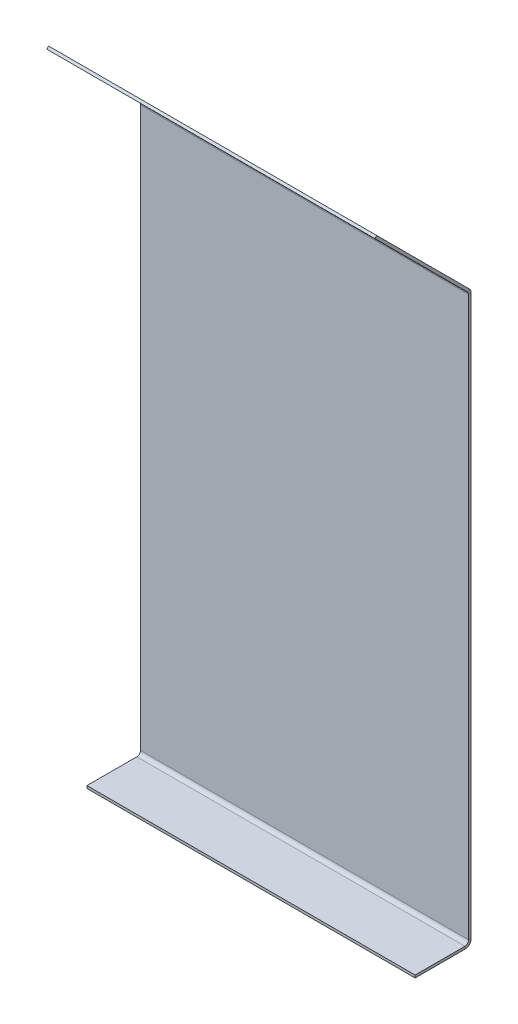
ISO-10303-21;
HEADER;
FILE_DESCRIPTION(('STEP AP214'),'2;1');
FILE_NAME('part.step','',(''),(''),'','','');
FILE_SCHEMA(('AUTOMOTIVE_DESIGN { 1 0 10303 214 1 1 1 1 }'));
ENDSEC;
DATA;
#1=APPLICATION_CONTEXT('core data for automotive mechanical design processes');
#2=APPLICATION_PROTOCOL_DEFINITION('international standard','automotive_design',2000,#1);
#3=PRODUCT_CONTEXT('',#1,'mechanical');
#4=PRODUCT('Part','Part','',(#3));
#5=PRODUCT_RELATED_PRODUCT_CATEGORY('part','',(#4));
#6=PRODUCT_DEFINITION_FORMATION('','',#4);
#7=PRODUCT_DEFINITION_CONTEXT('part definition',#1,'design');
#8=PRODUCT_DEFINITION('design','',#6,#7);
#9=PRODUCT_DEFINITION_SHAPE('','',#8);
#10=(LENGTH_UNIT() NAMED_UNIT(*) SI_UNIT(.MILLI.,.METRE.));
#11=(NAMED_UNIT(*) PLANE_ANGLE_UNIT() SI_UNIT($,.RADIAN.));
#12=(NAMED_UNIT(*) SI_UNIT($,.STERADIAN.) SOLID_ANGLE_UNIT());
#13=UNCERTAINTY_MEASURE_WITH_UNIT(LENGTH_MEASURE(1.E-05),#10,'distance_accuracy_value','');
#14=(GEOMETRIC_REPRESENTATION_CONTEXT(3) GLOBAL_UNCERTAINTY_ASSIGNED_CONTEXT((#13)) GLOBAL_UNIT_ASSIGNED_CONTEXT((#10,
#11,#12)) REPRESENTATION_CONTEXT('',''));
#15=CARTESIAN_POINT('',(0.,0.,0.));
#16=DIRECTION('',(0.,0.,1.));
#17=DIRECTION('',(1.,0.,0.));
#18=AXIS2_PLACEMENT_3D('',#15,#16,#17);
#19=CARTESIAN_POINT('',(44.45,-0.7,6.35));
#20=DIRECTION('',(1.,0.,0.));
#21=DIRECTION('',(0.,0.,-1.));
#22=AXIS2_PLACEMENT_3D('',#19,#20,#21);
#23=PLANE('',#22);
#24=DIRECTION('',(0.,0.,-1.));
#25=VECTOR('',#24,1.);
#26=CARTESIAN_POINT('',(44.45,0.,6.35));
#27=LINE('',#26,#25);
#28=CARTESIAN_POINT('',(44.45,0.,6.35));
#29=VERTEX_POINT('',#28);
#30=CARTESIAN_POINT('',(44.45,0.,-7.15));
#31=VERTEX_POINT('',#30);
#32=EDGE_CURVE('E271',#29,#31,#27,.T.);
#33=ORIENTED_EDGE('',*,*,#32,.F.);
#34=DIRECTION('',(0.,1.,0.));
#35=VECTOR('',#34,1.);
#36=CARTESIAN_POINT('',(44.45,-0.7,6.35));
#37=LINE('',#36,#35);
#38=CARTESIAN_POINT('',(44.45,-0.7,6.35));
#39=VERTEX_POINT('',#38);
#40=EDGE_CURVE('E13',#39,#29,#37,.T.);
#41=ORIENTED_EDGE('',*,*,#40,.F.);
#42=DIRECTION('',(0.,0.,-1.));
#43=VECTOR('',#42,1.);
#44=CARTESIAN_POINT('',(44.45,-0.7,6.35));
#45=LINE('',#44,#43);
#46=CARTESIAN_POINT('',(44.45,-0.700000000000012,-7.15));
#47=VERTEX_POINT('',#46);
#48=EDGE_CURVE('E274',#39,#47,#45,.T.);
#49=ORIENTED_EDGE('',*,*,#48,.T.);
#50=DIRECTION('',(0.,-1.,0.));
#51=VECTOR('',#50,1.);
#52=CARTESIAN_POINT('',(44.45,0.,-7.15));
#53=LINE('',#52,#51);
#54=EDGE_CURVE('E269',#31,#47,#53,.T.);
#55=ORIENTED_EDGE('',*,*,#54,.F.);
#56=EDGE_LOOP('',(#33,#41,#49,#55));
#57=FACE_BOUND('',#56,.T.);
#58=ADVANCED_FACE('F76',(#57),#23,.T.);
#59=CARTESIAN_POINT('',(-44.45,-0.7,6.35));
#60=DIRECTION('',(0.,0.,1.));
#61=DIRECTION('',(1.,0.,0.));
#62=AXIS2_PLACEMENT_3D('',#59,#60,#61);
#63=PLANE('',#62);
#64=DIRECTION('',(1.,0.,0.));
#65=VECTOR('',#64,1.);
#66=CARTESIAN_POINT('',(-44.45,0.,6.35));
#67=LINE('',#66,#65);
#68=CARTESIAN_POINT('',(-44.45,0.,6.35));
#69=VERTEX_POINT('',#68);
#70=EDGE_CURVE('E277',#69,#29,#67,.T.);
#71=ORIENTED_EDGE('',*,*,#70,.F.);
#72=DIRECTION('',(0.,1.,0.));
#73=VECTOR('',#72,1.);
#74=CARTESIAN_POINT('',(-44.45,-0.7,6.35));
#75=LINE('',#74,#73);
#76=CARTESIAN_POINT('',(-44.45,-0.7,6.35));
#77=VERTEX_POINT('',#76);
#78=EDGE_CURVE('E79',#77,#69,#75,.T.);
#79=ORIENTED_EDGE('',*,*,#78,.F.);
#80=DIRECTION('',(1.,0.,0.));
#81=VECTOR('',#80,1.);
#82=CARTESIAN_POINT('',(-44.45,-0.7,6.35));
#83=LINE('',#82,#81);
#84=EDGE_CURVE('E279',#77,#39,#83,.T.);
#85=ORIENTED_EDGE('',*,*,#84,.T.);
#86=ORIENTED_EDGE('',*,*,#40,.T.);
#87=EDGE_LOOP('',(#71,#79,#85,#86));
#88=FACE_BOUND('',#87,.T.);
#89=ADVANCED_FACE('F293',(#88),#63,.T.);
#90=CARTESIAN_POINT('',(-44.45,-0.7,6.35));
#91=DIRECTION('',(-1.,0.,0.));
#92=DIRECTION('',(0.,0.,1.));
#93=AXIS2_PLACEMENT_3D('',#90,#91,#92);
#94=PLANE('',#93);
#95=DIRECTION('',(0.,0.,1.));
#96=VECTOR('',#95,1.);
#97=CARTESIAN_POINT('',(-44.45,0.,6.35));
#98=LINE('',#97,#96);
#99=CARTESIAN_POINT('',(-44.45,0.,-7.15));
#100=VERTEX_POINT('',#99);
#101=EDGE_CURVE('E284',#100,#69,#98,.T.);
#102=ORIENTED_EDGE('',*,*,#101,.F.);
#103=DIRECTION('',(0.,-1.,0.));
#104=VECTOR('',#103,1.);
#105=CARTESIAN_POINT('',(-44.45,0.,-7.15));
#106=LINE('',#105,#104);
#107=CARTESIAN_POINT('',(-44.45,-0.700000000000012,-7.15));
#108=VERTEX_POINT('',#107);
#109=EDGE_CURVE('E259',#100,#108,#106,.T.);
#110=ORIENTED_EDGE('',*,*,#109,.T.);
#111=DIRECTION('',(0.,0.,1.));
#112=VECTOR('',#111,1.);
#113=CARTESIAN_POINT('',(-44.45,-0.7,6.35));
#114=LINE('',#113,#112);
#115=EDGE_CURVE('E276',#108,#77,#114,.T.);
#116=ORIENTED_EDGE('',*,*,#115,.T.);
#117=ORIENTED_EDGE('',*,*,#78,.T.);
#118=EDGE_LOOP('',(#102,#110,#116,#117));
#119=FACE_BOUND('',#118,.T.);
#120=ADVANCED_FACE('F342',(#119),#94,.T.);
#121=CARTESIAN_POINT('',(0.,-0.7,0.));
#122=DIRECTION('',(0.,-1.,0.));
#123=DIRECTION('',(0.,0.,-1.));
#124=AXIS2_PLACEMENT_3D('',#121,#122,#123);
#125=PLANE('',#124);
#126=ORIENTED_EDGE('',*,*,#48,.F.);
#127=ORIENTED_EDGE('',*,*,#84,.F.);
#128=ORIENTED_EDGE('',*,*,#115,.F.);
#129=DIRECTION('',(-1.,0.,0.));
#130=VECTOR('',#129,1.);
#131=CARTESIAN_POINT('',(-44.45,-0.700000000000012,-7.15));
#132=LINE('',#131,#130);
#133=EDGE_CURVE('E254',#108,#47,#132,.F.);
#134=ORIENTED_EDGE('',*,*,#133,.T.);
#135=EDGE_LOOP('',(#126,#127,#128,#134));
#136=FACE_BOUND('',#135,.T.);
#137=ADVANCED_FACE('F341',(#136),#125,.T.);
#138=CARTESIAN_POINT('',(0.,0.,0.));
#139=DIRECTION('',(0.,-1.,0.));
#140=DIRECTION('',(0.,0.,-1.));
#141=AXIS2_PLACEMENT_3D('',#138,#139,#140);
#142=PLANE('',#141);
#143=ORIENTED_EDGE('',*,*,#32,.T.);
#144=DIRECTION('',(-1.,0.,0.));
#145=VECTOR('',#144,1.);
#146=CARTESIAN_POINT('',(-44.45,0.,-7.15));
#147=LINE('',#146,#145);
#148=EDGE_CURVE('E265',#100,#31,#147,.F.);
#149=ORIENTED_EDGE('',*,*,#148,.F.);
#150=ORIENTED_EDGE('',*,*,#101,.T.);
#151=ORIENTED_EDGE('',*,*,#70,.T.);
#152=EDGE_LOOP('',(#143,#149,#150,#151));
#153=FACE_BOUND('',#152,.T.);
#154=ADVANCED_FACE('F289',(#153),#142,.F.);
#155=CARTESIAN_POINT('',(44.45,0.999999999999988,-7.15));
#156=DIRECTION('',(1.,0.,0.));
#157=DIRECTION('',(0.,0.,-1.));
#158=AXIS2_PLACEMENT_3D('',#155,#156,#157);
#159=PLANE('',#158);
#160=DIRECTION('',(0.,0.,1.));
#161=VECTOR('',#160,1.);
#162=CARTESIAN_POINT('',(44.45,1.,-8.84999999999999));
#163=LINE('',#162,#161);
#164=CARTESIAN_POINT('',(44.45,0.999999999999985,-8.15));
#165=VERTEX_POINT('',#164);
#166=CARTESIAN_POINT('',(44.45,0.999999999999982,-8.85));
#167=VERTEX_POINT('',#166);
#168=EDGE_CURVE('E212',#165,#167,#163,.F.);
#169=ORIENTED_EDGE('',*,*,#168,.F.);
#170=CARTESIAN_POINT('',(44.45,0.999999999999988,-7.15));
#171=DIRECTION('',(-1.,0.,0.));
#172=DIRECTION('',(0.,0.,1.));
#173=AXIS2_PLACEMENT_3D('',#170,#171,#172);
#174=CIRCLE('',#173,1.);
#175=EDGE_CURVE('E262',#31,#165,#174,.F.);
#176=ORIENTED_EDGE('',*,*,#175,.F.);
#177=ORIENTED_EDGE('',*,*,#54,.T.);
#178=CARTESIAN_POINT('',(44.45,0.999999999999988,-7.15));
#179=DIRECTION('',(-1.,0.,0.));
#180=DIRECTION('',(0.,0.,1.));
#181=AXIS2_PLACEMENT_3D('',#178,#179,#180);
#182=CIRCLE('',#181,1.7);
#183=EDGE_CURVE('E108',#47,#167,#182,.F.);
#184=ORIENTED_EDGE('',*,*,#183,.T.);
#185=EDGE_LOOP('',(#169,#176,#177,#184));
#186=FACE_BOUND('',#185,.T.);
#187=ADVANCED_FACE('F297',(#186),#159,.T.);
#188=CARTESIAN_POINT('',(-44.45,0.999999999999988,-7.15));
#189=DIRECTION('',(1.,0.,0.));
#190=DIRECTION('',(0.,0.,-1.));
#191=AXIS2_PLACEMENT_3D('',#188,#189,#190);
#192=PLANE('',#191);
#193=CARTESIAN_POINT('',(-44.45,0.999999999999988,-7.15));
#194=DIRECTION('',(-1.,0.,0.));
#195=DIRECTION('',(0.,0.,1.));
#196=AXIS2_PLACEMENT_3D('',#193,#194,#195);
#197=CIRCLE('',#196,1.);
#198=CARTESIAN_POINT('',(-44.45,0.999999999999985,-8.15));
#199=VERTEX_POINT('',#198);
#200=EDGE_CURVE('E224',#199,#100,#197,.T.);
#201=ORIENTED_EDGE('',*,*,#200,.F.);
#202=DIRECTION('',(0.,0.,1.));
#203=VECTOR('',#202,1.);
#204=CARTESIAN_POINT('',(-44.45,0.999999999999994,-8.15));
#205=LINE('',#204,#203);
#206=CARTESIAN_POINT('',(-44.45,0.999999999999999,-8.85));
#207=VERTEX_POINT('',#206);
#208=EDGE_CURVE('E247',#199,#207,#205,.F.);
#209=ORIENTED_EDGE('',*,*,#208,.T.);
#210=CARTESIAN_POINT('',(-44.45,0.999999999999988,-7.15));
#211=DIRECTION('',(-1.,0.,0.));
#212=DIRECTION('',(0.,0.,1.));
#213=AXIS2_PLACEMENT_3D('',#210,#211,#212);
#214=CIRCLE('',#213,1.7);
#215=EDGE_CURVE('E257',#207,#108,#214,.T.);
#216=ORIENTED_EDGE('',*,*,#215,.T.);
#217=ORIENTED_EDGE('',*,*,#109,.F.);
#218=EDGE_LOOP('',(#201,#209,#216,#217));
#219=FACE_BOUND('',#218,.T.);
#220=ADVANCED_FACE('F337',(#219),#192,.F.);
#221=CARTESIAN_POINT('',(-44.45,0.999999999999988,-7.15));
#222=DIRECTION('',(-1.,0.,0.));
#223=DIRECTION('',(0.,0.,-1.));
#224=AXIS2_PLACEMENT_3D('',#221,#222,#223);
#225=CYLINDRICAL_SURFACE('',#224,1.7);
#226=ORIENTED_EDGE('',*,*,#133,.F.);
#227=ORIENTED_EDGE('',*,*,#215,.F.);
#228=DIRECTION('',(-1.,0.,0.));
#229=VECTOR('',#228,1.);
#230=CARTESIAN_POINT('',(44.45,1.,-8.85));
#231=LINE('',#230,#229);
#232=EDGE_CURVE('E245',#207,#167,#231,.F.);
#233=ORIENTED_EDGE('',*,*,#232,.T.);
#234=ORIENTED_EDGE('',*,*,#183,.F.);
#235=EDGE_LOOP('',(#226,#227,#233,#234));
#236=FACE_BOUND('',#235,.T.);
#237=ADVANCED_FACE('F339',(#236),#225,.T.);
#238=CARTESIAN_POINT('',(-44.45,0.999999999999988,-7.15));
#239=DIRECTION('',(-1.,0.,0.));
#240=DIRECTION('',(0.,0.,-1.));
#241=AXIS2_PLACEMENT_3D('',#238,#239,#240);
#242=CYLINDRICAL_SURFACE('',#241,1.);
#243=ORIENTED_EDGE('',*,*,#148,.T.);
#244=ORIENTED_EDGE('',*,*,#175,.T.);
#245=DIRECTION('',(-1.,0.,0.));
#246=VECTOR('',#245,1.);
#247=CARTESIAN_POINT('',(44.45,0.999999999999997,-8.15));
#248=LINE('',#247,#246);
#249=EDGE_CURVE('E250',#165,#199,#248,.T.);
#250=ORIENTED_EDGE('',*,*,#249,.T.);
#251=ORIENTED_EDGE('',*,*,#200,.T.);
#252=EDGE_LOOP('',(#243,#244,#250,#251));
#253=FACE_BOUND('',#252,.T.);
#254=ADVANCED_FACE('F300',(#253),#242,.F.);
#255=CARTESIAN_POINT('',(44.45,0.,-8.85));
#256=DIRECTION('',(-1.,0.,0.));
#257=DIRECTION('',(0.,0.,1.));
#258=AXIS2_PLACEMENT_3D('',#255,#256,#257);
#259=PLANE('',#258);
#260=ORIENTED_EDGE('',*,*,#168,.T.);
#261=DIRECTION('',(0.,-1.,0.));
#262=VECTOR('',#261,1.);
#263=CARTESIAN_POINT('',(44.45,0.,-8.85));
#264=LINE('',#263,#262);
#265=CARTESIAN_POINT('',(44.45,152.4,-8.85000000000053));
#266=VERTEX_POINT('',#265);
#267=EDGE_CURVE('E234',#266,#167,#264,.T.);
#268=ORIENTED_EDGE('',*,*,#267,.F.);
#269=DIRECTION('',(0.,0.,1.));
#270=VECTOR('',#269,1.);
#271=CARTESIAN_POINT('',(44.45,152.4,-8.85000000000053));
#272=LINE('',#271,#270);
#273=CARTESIAN_POINT('',(44.45,152.4,-8.15000000000055));
#274=VERTEX_POINT('',#273);
#275=EDGE_CURVE('E225',#266,#274,#272,.T.);
#276=ORIENTED_EDGE('',*,*,#275,.T.);
#277=DIRECTION('',(0.,1.,0.));
#278=VECTOR('',#277,1.);
#279=CARTESIAN_POINT('',(44.45,0.,-8.15));
#280=LINE('',#279,#278);
#281=EDGE_CURVE('E242',#274,#165,#280,.F.);
#282=ORIENTED_EDGE('',*,*,#281,.T.);
#283=EDGE_LOOP('',(#260,#268,#276,#282));
#284=FACE_BOUND('',#283,.T.);
#285=ADVANCED_FACE('F308',(#284),#259,.F.);
#286=CARTESIAN_POINT('',(-44.45,152.4,-8.85000000000053));
#287=DIRECTION('',(1.,0.,0.));
#288=DIRECTION('',(0.,1.,0.));
#289=AXIS2_PLACEMENT_3D('',#286,#287,#288);
#290=PLANE('',#289);
#291=ORIENTED_EDGE('',*,*,#208,.F.);
#292=DIRECTION('',(0.,-1.,0.));
#293=VECTOR('',#292,1.);
#294=CARTESIAN_POINT('',(-44.45,152.4,-8.15000000000053));
#295=LINE('',#294,#293);
#296=CARTESIAN_POINT('',(-44.45,152.4,-8.15000000000055));
#297=VERTEX_POINT('',#296);
#298=EDGE_CURVE('E239',#199,#297,#295,.F.);
#299=ORIENTED_EDGE('',*,*,#298,.T.);
#300=DIRECTION('',(0.,0.,1.));
#301=VECTOR('',#300,1.);
#302=CARTESIAN_POINT('',(-44.45,152.4,-8.85000000000053));
#303=LINE('',#302,#301);
#304=CARTESIAN_POINT('',(-44.45,152.4,-8.85000000000055));
#305=VERTEX_POINT('',#304);
#306=EDGE_CURVE('E222',#305,#297,#303,.T.);
#307=ORIENTED_EDGE('',*,*,#306,.F.);
#308=DIRECTION('',(0.,1.,0.));
#309=VECTOR('',#308,1.);
#310=CARTESIAN_POINT('',(-44.45,0.,-8.85));
#311=LINE('',#310,#309);
#312=EDGE_CURVE('E231',#207,#305,#311,.T.);
#313=ORIENTED_EDGE('',*,*,#312,.F.);
#314=EDGE_LOOP('',(#291,#299,#307,#313));
#315=FACE_BOUND('',#314,.T.);
#316=ADVANCED_FACE('F335',(#315),#290,.F.);
#317=CARTESIAN_POINT('',(0.,0.,-8.85));
#318=DIRECTION('',(0.,0.,1.));
#319=DIRECTION('',(0.,-1.,0.));
#320=AXIS2_PLACEMENT_3D('',#317,#318,#319);
#321=PLANE('',#320);
#322=ORIENTED_EDGE('',*,*,#232,.F.);
#323=ORIENTED_EDGE('',*,*,#312,.T.);
#324=DIRECTION('',(1.,0.,0.));
#325=VECTOR('',#324,1.);
#326=CARTESIAN_POINT('',(0.,152.4,-8.85000000000053));
#327=LINE('',#326,#325);
#328=EDGE_CURVE('E228',#305,#266,#327,.T.);
#329=ORIENTED_EDGE('',*,*,#328,.T.);
#330=ORIENTED_EDGE('',*,*,#267,.T.);
#331=EDGE_LOOP('',(#322,#323,#329,#330));
#332=FACE_BOUND('',#331,.T.);
#333=ADVANCED_FACE('F316',(#332),#321,.F.);
#334=CARTESIAN_POINT('',(0.,0.,-8.15));
#335=DIRECTION('',(0.,0.,1.));
#336=DIRECTION('',(0.,-1.,0.));
#337=AXIS2_PLACEMENT_3D('',#334,#335,#336);
#338=PLANE('',#337);
#339=ORIENTED_EDGE('',*,*,#298,.F.);
#340=ORIENTED_EDGE('',*,*,#249,.F.);
#341=ORIENTED_EDGE('',*,*,#281,.F.);
#342=DIRECTION('',(-1.,0.,0.));
#343=VECTOR('',#342,1.);
#344=CARTESIAN_POINT('',(44.45,152.4,-8.15000000000053));
#345=LINE('',#344,#343);
#346=EDGE_CURVE('E237',#297,#274,#345,.F.);
#347=ORIENTED_EDGE('',*,*,#346,.F.);
#348=EDGE_LOOP('',(#339,#340,#341,#347));
#349=FACE_BOUND('',#348,.T.);
#350=ADVANCED_FACE('F305',(#349),#338,.T.);
#351=CARTESIAN_POINT('',(44.45,152.4,-7.15000000000055));
#352=DIRECTION('',(1.,0.,0.));
#353=DIRECTION('',(0.,0.,-1.));
#354=AXIS2_PLACEMENT_3D('',#351,#352,#353);
#355=PLANE('',#354);
#356=DIRECTION('',(0.,-0.707106781186541,0.707106781186554));
#357=VECTOR('',#356,1.);
#358=CARTESIAN_POINT('',(44.45,153.602081528017,-8.35208152801769));
#359=LINE('',#358,#357);
#360=CARTESIAN_POINT('',(44.45,153.107106781187,-7.8571067811871));
#361=VERTEX_POINT('',#360);
#362=CARTESIAN_POINT('',(44.45,153.602081528017,-8.35208152801769));
#363=VERTEX_POINT('',#362);
#364=EDGE_CURVE('E191',#361,#363,#359,.F.);
#365=ORIENTED_EDGE('',*,*,#364,.F.);
#366=CARTESIAN_POINT('',(44.45,152.4,-7.15000000000055));
#367=DIRECTION('',(-1.,0.,0.));
#368=DIRECTION('',(0.,0.,1.));
#369=AXIS2_PLACEMENT_3D('',#366,#367,#368);
#370=CIRCLE('',#369,1.);
#371=EDGE_CURVE('E216',#274,#361,#370,.F.);
#372=ORIENTED_EDGE('',*,*,#371,.F.);
#373=ORIENTED_EDGE('',*,*,#275,.F.);
#374=CARTESIAN_POINT('',(44.45,152.4,-7.15000000000055));
#375=DIRECTION('',(-1.,0.,0.));
#376=DIRECTION('',(0.,0.,1.));
#377=AXIS2_PLACEMENT_3D('',#374,#375,#376);
#378=CIRCLE('',#377,1.7);
#379=EDGE_CURVE('E209',#266,#363,#378,.F.);
#380=ORIENTED_EDGE('',*,*,#379,.T.);
#381=EDGE_LOOP('',(#365,#372,#373,#380));
#382=FACE_BOUND('',#381,.T.);
#383=ADVANCED_FACE('F313',(#382),#355,.T.);
#384=CARTESIAN_POINT('',(-44.45,152.4,-7.15000000000055));
#385=DIRECTION('',(1.,0.,0.));
#386=DIRECTION('',(0.,0.,-1.));
#387=AXIS2_PLACEMENT_3D('',#384,#385,#386);
#388=PLANE('',#387);
#389=CARTESIAN_POINT('',(-44.45,152.4,-7.15000000000055));
#390=DIRECTION('',(-1.,0.,0.));
#391=DIRECTION('',(0.,0.,1.));
#392=AXIS2_PLACEMENT_3D('',#389,#390,#391);
#393=CIRCLE('',#392,1.);
#394=CARTESIAN_POINT('',(-44.45,153.107106781187,-7.8571067811871));
#395=VERTEX_POINT('',#394);
#396=EDGE_CURVE('E219',#395,#297,#393,.T.);
#397=ORIENTED_EDGE('',*,*,#396,.F.);
#398=DIRECTION('',(0.,-0.707106781186541,0.707106781186554));
#399=VECTOR('',#398,1.);
#400=CARTESIAN_POINT('',(-44.45,153.107106781187,-7.85710678118711));
#401=LINE('',#400,#399);
#402=CARTESIAN_POINT('',(-44.45,153.602081528017,-8.35208152801769));
#403=VERTEX_POINT('',#402);
#404=EDGE_CURVE('E203',#395,#403,#401,.F.);
#405=ORIENTED_EDGE('',*,*,#404,.T.);
#406=CARTESIAN_POINT('',(-44.45,152.4,-7.15000000000055));
#407=DIRECTION('',(-1.,0.,0.));
#408=DIRECTION('',(0.,0.,1.));
#409=AXIS2_PLACEMENT_3D('',#406,#407,#408);
#410=CIRCLE('',#409,1.7);
#411=EDGE_CURVE('E213',#403,#305,#410,.T.);
#412=ORIENTED_EDGE('',*,*,#411,.T.);
#413=ORIENTED_EDGE('',*,*,#306,.T.);
#414=EDGE_LOOP('',(#397,#405,#412,#413));
#415=FACE_BOUND('',#414,.T.);
#416=ADVANCED_FACE('F323',(#415),#388,.F.);
#417=CARTESIAN_POINT('',(-44.45,152.4,-7.15000000000055));
#418=DIRECTION('',(-1.,0.,0.));
#419=DIRECTION('',(0.,0.707106781186541,-0.707106781186554));
#420=AXIS2_PLACEMENT_3D('',#417,#418,#419);
#421=CYLINDRICAL_SURFACE('',#420,1.7);
#422=ORIENTED_EDGE('',*,*,#328,.F.);
#423=ORIENTED_EDGE('',*,*,#411,.F.);
#424=DIRECTION('',(-1.,0.,0.));
#425=VECTOR('',#424,1.);
#426=CARTESIAN_POINT('',(44.45,153.602081528017,-8.35208152801769));
#427=LINE('',#426,#425);
#428=EDGE_CURVE('E201',#403,#363,#427,.F.);
#429=ORIENTED_EDGE('',*,*,#428,.T.);
#430=ORIENTED_EDGE('',*,*,#379,.F.);
#431=EDGE_LOOP('',(#422,#423,#429,#430));
#432=FACE_BOUND('',#431,.T.);
#433=ADVANCED_FACE('F320',(#432),#421,.T.);
#434=CARTESIAN_POINT('',(-44.45,152.4,-7.15000000000055));
#435=DIRECTION('',(-1.,0.,0.));
#436=DIRECTION('',(0.,0.707106781186541,-0.707106781186554));
#437=AXIS2_PLACEMENT_3D('',#434,#435,#436);
#438=CYLINDRICAL_SURFACE('',#437,1.);
#439=ORIENTED_EDGE('',*,*,#346,.T.);
#440=ORIENTED_EDGE('',*,*,#371,.T.);
#441=DIRECTION('',(-1.,0.,0.));
#442=VECTOR('',#441,1.);
#443=CARTESIAN_POINT('',(44.45,153.107106781187,-7.8571067811871));
#444=LINE('',#443,#442);
#445=EDGE_CURVE('E206',#361,#395,#444,.T.);
#446=ORIENTED_EDGE('',*,*,#445,.T.);
#447=ORIENTED_EDGE('',*,*,#396,.T.);
#448=EDGE_LOOP('',(#439,#440,#446,#447));
#449=FACE_BOUND('',#448,.T.);
#450=ADVANCED_FACE('F332',(#449),#438,.F.);
#451=CARTESIAN_POINT('',(-44.45,178.705352619587,16.7511895635522));
#452=DIRECTION('',(1.,0.,0.));
#453=DIRECTION('',(0.,0.,-1.));
#454=AXIS2_PLACEMENT_3D('',#451,#452,#453);
#455=PLANE('',#454);
#456=ORIENTED_EDGE('',*,*,#404,.F.);
#457=DIRECTION('',(0.,-0.707106781186554,-0.707106781186541));
#458=VECTOR('',#457,1.);
#459=CARTESIAN_POINT('',(-44.45,178.210377872757,17.2461643103828));
#460=LINE('',#459,#458);
#461=CARTESIAN_POINT('',(-44.45,178.210377872757,17.2461643103828));
#462=VERTEX_POINT('',#461);
#463=EDGE_CURVE('E199',#395,#462,#460,.F.);
#464=ORIENTED_EDGE('',*,*,#463,.T.);
#465=DIRECTION('',(0.,-0.707106781186541,0.707106781186554));
#466=VECTOR('',#465,1.);
#467=CARTESIAN_POINT('',(-44.45,178.705352619587,16.7511895635522));
#468=LINE('',#467,#466);
#469=CARTESIAN_POINT('',(-44.45,178.705352619587,16.7511895635522));
#470=VERTEX_POINT('',#469);
#471=EDGE_CURVE('E187',#470,#462,#468,.T.);
#472=ORIENTED_EDGE('',*,*,#471,.F.);
#473=DIRECTION('',(0.,0.707106781186554,0.707106781186541));
#474=VECTOR('',#473,1.);
#475=CARTESIAN_POINT('',(-44.45,81.1841883092026,-80.7699747468309));
#476=LINE('',#475,#474);
#477=EDGE_CURVE('E174',#403,#470,#476,.T.);
#478=ORIENTED_EDGE('',*,*,#477,.F.);
#479=EDGE_LOOP('',(#456,#464,#472,#478));
#480=FACE_BOUND('',#479,.T.);
#481=ADVANCED_FACE('F327',(#480),#455,.F.);
#482=CARTESIAN_POINT('',(44.45,153.309188309204,-8.64497474683114));
#483=DIRECTION('',(-1.,0.,0.));
#484=DIRECTION('',(0.,0.,1.));
#485=AXIS2_PLACEMENT_3D('',#482,#483,#484);
#486=PLANE('',#485);
#487=ORIENTED_EDGE('',*,*,#364,.T.);
#488=DIRECTION('',(0.,-0.707106781186554,-0.707106781186541));
#489=VECTOR('',#488,1.);
#490=CARTESIAN_POINT('',(44.45,81.1841883092026,-80.7699747468309));
#491=LINE('',#490,#489);
#492=CARTESIAN_POINT('',(44.45,178.705352619587,16.7511895635522));
#493=VERTEX_POINT('',#492);
#494=EDGE_CURVE('E172',#493,#363,#491,.T.);
#495=ORIENTED_EDGE('',*,*,#494,.F.);
#496=DIRECTION('',(0.,-0.707106781186541,0.707106781186554));
#497=VECTOR('',#496,1.);
#498=CARTESIAN_POINT('',(44.45,178.705352619587,16.7511895635522));
#499=LINE('',#498,#497);
#500=CARTESIAN_POINT('',(44.45,178.210377872757,17.2461643103828));
#501=VERTEX_POINT('',#500);
#502=EDGE_CURVE('E180',#493,#501,#499,.T.);
#503=ORIENTED_EDGE('',*,*,#502,.T.);
#504=DIRECTION('',(0.,0.707106781186554,0.707106781186541));
#505=VECTOR('',#504,1.);
#506=CARTESIAN_POINT('',(44.45,152.814213562373,-8.15000000000055));
#507=LINE('',#506,#505);
#508=EDGE_CURVE('E196',#501,#361,#507,.F.);
#509=ORIENTED_EDGE('',*,*,#508,.T.);
#510=EDGE_LOOP('',(#487,#495,#503,#509));
#511=FACE_BOUND('',#510,.T.);
#512=ADVANCED_FACE('F190',(#511),#486,.F.);
#513=CARTESIAN_POINT('',(0.,81.1841883092026,-80.7699747468309));
#514=DIRECTION('',(0.,-0.707106781186541,0.707106781186554));
#515=DIRECTION('',(0.,-0.707106781186554,-0.707106781186541));
#516=AXIS2_PLACEMENT_3D('',#513,#514,#515);
#517=PLANE('',#516);
#518=ORIENTED_EDGE('',*,*,#428,.F.);
#519=ORIENTED_EDGE('',*,*,#477,.T.);
#520=DIRECTION('',(1.,0.,0.));
#521=VECTOR('',#520,1.);
#522=CARTESIAN_POINT('',(0.,178.705352619587,16.7511895635522));
#523=LINE('',#522,#521);
#524=EDGE_CURVE('E167',#470,#493,#523,.T.);
#525=ORIENTED_EDGE('',*,*,#524,.T.);
#526=ORIENTED_EDGE('',*,*,#494,.T.);
#527=EDGE_LOOP('',(#518,#519,#525,#526));
#528=FACE_BOUND('',#527,.T.);
#529=ADVANCED_FACE('F170',(#528),#517,.F.);
#530=CARTESIAN_POINT('',(0.,80.689213562372,-80.2750000000003));
#531=DIRECTION('',(0.,-0.707106781186541,0.707106781186554));
#532=DIRECTION('',(0.,-0.707106781186554,-0.707106781186541));
#533=AXIS2_PLACEMENT_3D('',#530,#531,#532);
#534=PLANE('',#533);
#535=ORIENTED_EDGE('',*,*,#463,.F.);
#536=ORIENTED_EDGE('',*,*,#445,.F.);
#537=ORIENTED_EDGE('',*,*,#508,.F.);
#538=DIRECTION('',(-1.,0.,0.));
#539=VECTOR('',#538,1.);
#540=CARTESIAN_POINT('',(44.45,178.210377872757,17.2461643103828));
#541=LINE('',#540,#539);
#542=EDGE_CURVE('E183',#462,#501,#541,.F.);
#543=ORIENTED_EDGE('',*,*,#542,.F.);
#544=EDGE_LOOP('',(#535,#536,#537,#543));
#545=FACE_BOUND('',#544,.T.);
#546=ADVANCED_FACE('F329',(#545),#534,.T.);
#547=CARTESIAN_POINT('',(44.45,178.705352619587,16.7511895635522));
#548=DIRECTION('',(0.,-0.707106781186554,-0.707106781186541));
#549=DIRECTION('',(0.,0.707106781186541,-0.707106781186554));
#550=AXIS2_PLACEMENT_3D('',#547,#548,#549);
#551=PLANE('',#550);
#552=ORIENTED_EDGE('',*,*,#542,.T.);
#553=ORIENTED_EDGE('',*,*,#502,.F.);
#554=ORIENTED_EDGE('',*,*,#524,.F.);
#555=ORIENTED_EDGE('',*,*,#471,.T.);
#556=EDGE_LOOP('',(#552,#553,#554,#555));
#557=FACE_BOUND('',#556,.T.);
#558=ADVANCED_FACE('F181',(#557),#551,.F.);
#559=CLOSED_SHELL('',(#58,#89,#120,#137,#154,#187,#220,#237,#254,#285,#316,#333,#350,#383,#416,
#433,#450,#481,#512,#529,#546,#558));
#560=MANIFOLD_SOLID_BREP('B2',#559);
#561=ADVANCED_BREP_SHAPE_REPRESENTATION('',(#18,#560),#14);
#562=SHAPE_DEFINITION_REPRESENTATION(#9,#561);
ENDSEC;
END-ISO-10303-21;
